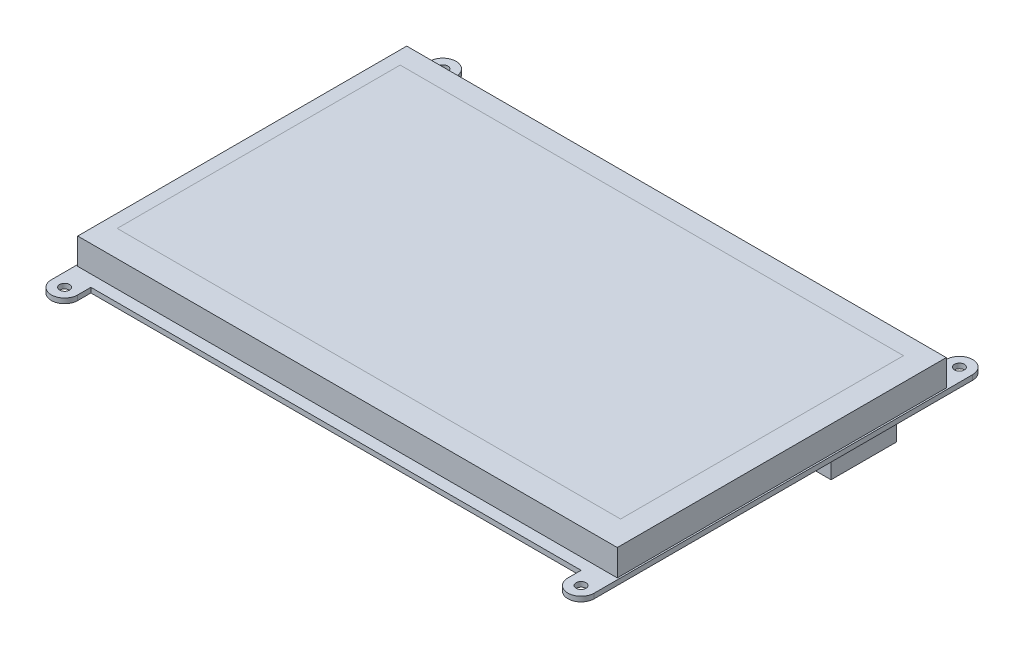
ISO-10303-21;
HEADER;
FILE_DESCRIPTION(('STEP AP214'),'2;1');
FILE_NAME('part.step','',(''),(''),'','','');
FILE_SCHEMA(('AUTOMOTIVE_DESIGN { 1 0 10303 214 1 1 1 1 }'));
ENDSEC;
DATA;
#1=APPLICATION_CONTEXT('core data for automotive mechanical design processes');
#2=APPLICATION_PROTOCOL_DEFINITION('international standard','automotive_design',2000,#1);
#3=PRODUCT_CONTEXT('',#1,'mechanical');
#4=PRODUCT('Part','Part','',(#3));
#5=PRODUCT_RELATED_PRODUCT_CATEGORY('part','',(#4));
#6=PRODUCT_DEFINITION_FORMATION('','',#4);
#7=PRODUCT_DEFINITION_CONTEXT('part definition',#1,'design');
#8=PRODUCT_DEFINITION('design','',#6,#7);
#9=PRODUCT_DEFINITION_SHAPE('','',#8);
#10=(LENGTH_UNIT() NAMED_UNIT(*) SI_UNIT(.MILLI.,.METRE.));
#11=(NAMED_UNIT(*) PLANE_ANGLE_UNIT() SI_UNIT($,.RADIAN.));
#12=(NAMED_UNIT(*) SI_UNIT($,.STERADIAN.) SOLID_ANGLE_UNIT());
#13=UNCERTAINTY_MEASURE_WITH_UNIT(LENGTH_MEASURE(1.E-05),#10,'distance_accuracy_value','');
#14=(GEOMETRIC_REPRESENTATION_CONTEXT(3) GLOBAL_UNCERTAINTY_ASSIGNED_CONTEXT((#13)) GLOBAL_UNIT_ASSIGNED_CONTEXT((#10,
#11,#12)) REPRESENTATION_CONTEXT('',''));
#15=CARTESIAN_POINT('',(0.,0.,0.));
#16=DIRECTION('',(0.,0.,1.));
#17=DIRECTION('',(1.,0.,0.));
#18=AXIS2_PLACEMENT_3D('',#15,#16,#17);
#19=CARTESIAN_POINT('',(0.,9.5,0.));
#20=DIRECTION('',(0.,-1.,0.));
#21=DIRECTION('',(0.,0.,-1.));
#22=AXIS2_PLACEMENT_3D('',#19,#20,#21);
#23=PLANE('',#22);
#24=DIRECTION('',(0.,0.,-1.));
#25=VECTOR('',#24,1.);
#26=CARTESIAN_POINT('',(82.,9.5,50.));
#27=LINE('',#26,#25);
#28=CARTESIAN_POINT('',(82.,9.5,50.));
#29=VERTEX_POINT('',#28);
#30=CARTESIAN_POINT('',(82.,9.5,-50.));
#31=VERTEX_POINT('',#30);
#32=EDGE_CURVE('E216',#29,#31,#27,.T.);
#33=ORIENTED_EDGE('',*,*,#32,.T.);
#34=DIRECTION('',(-1.,0.,0.));
#35=VECTOR('',#34,1.);
#36=CARTESIAN_POINT('',(-82.,9.5,-50.));
#37=LINE('',#36,#35);
#38=CARTESIAN_POINT('',(-82.,9.5,-50.));
#39=VERTEX_POINT('',#38);
#40=EDGE_CURVE('E205',#31,#39,#37,.T.);
#41=ORIENTED_EDGE('',*,*,#40,.T.);
#42=DIRECTION('',(0.,0.,1.));
#43=VECTOR('',#42,1.);
#44=CARTESIAN_POINT('',(-82.,9.5,50.));
#45=LINE('',#44,#43);
#46=CARTESIAN_POINT('',(-82.,9.5,50.));
#47=VERTEX_POINT('',#46);
#48=EDGE_CURVE('E215',#39,#47,#45,.T.);
#49=ORIENTED_EDGE('',*,*,#48,.T.);
#50=DIRECTION('',(1.,0.,0.));
#51=VECTOR('',#50,1.);
#52=CARTESIAN_POINT('',(-82.,9.5,50.));
#53=LINE('',#52,#51);
#54=EDGE_CURVE('E221',#47,#29,#53,.T.);
#55=ORIENTED_EDGE('',*,*,#54,.T.);
#56=EDGE_LOOP('',(#33,#41,#49,#55));
#57=FACE_BOUND('',#56,.T.);
#58=DIRECTION('',(0.,0.,1.));
#59=VECTOR('',#58,1.);
#60=CARTESIAN_POINT('',(-78.,9.5,0.));
#61=LINE('',#60,#59);
#62=CARTESIAN_POINT('',(-78.,9.5,-44.));
#63=VERTEX_POINT('',#62);
#64=CARTESIAN_POINT('',(-78.,9.5,42.));
#65=VERTEX_POINT('',#64);
#66=EDGE_CURVE('E11',#63,#65,#61,.T.);
#67=ORIENTED_EDGE('',*,*,#66,.F.);
#68=DIRECTION('',(-1.,0.,0.));
#69=VECTOR('',#68,1.);
#70=CARTESIAN_POINT('',(0.,9.5,-44.));
#71=LINE('',#70,#69);
#72=CARTESIAN_POINT('',(75.,9.5,-44.));
#73=VERTEX_POINT('',#72);
#74=EDGE_CURVE('E414',#73,#63,#71,.T.);
#75=ORIENTED_EDGE('',*,*,#74,.F.);
#76=DIRECTION('',(0.,0.,-1.));
#77=VECTOR('',#76,1.);
#78=CARTESIAN_POINT('',(75.,9.5,0.));
#79=LINE('',#78,#77);
#80=CARTESIAN_POINT('',(75.,9.5,42.));
#81=VERTEX_POINT('',#80);
#82=EDGE_CURVE('E417',#81,#73,#79,.T.);
#83=ORIENTED_EDGE('',*,*,#82,.F.);
#84=DIRECTION('',(1.,0.,0.));
#85=VECTOR('',#84,1.);
#86=CARTESIAN_POINT('',(0.,9.5,42.));
#87=LINE('',#86,#85);
#88=EDGE_CURVE('E46',#65,#81,#87,.T.);
#89=ORIENTED_EDGE('',*,*,#88,.F.);
#90=EDGE_LOOP('',(#67,#75,#83,#89));
#91=FACE_BOUND('',#90,.T.);
#92=ADVANCED_FACE('F37',(#57,#91),#23,.F.);
#93=CARTESIAN_POINT('',(78.5,1.5,-57.5));
#94=DIRECTION('',(0.,1.,0.));
#95=DIRECTION('',(0.,0.,1.));
#96=AXIS2_PLACEMENT_3D('',#93,#94,#95);
#97=PLANE('',#96);
#98=CARTESIAN_POINT('',(78.5,1.5,57.5));
#99=DIRECTION('',(0.,1.,0.));
#100=DIRECTION('',(0.,0.,-1.));
#101=AXIS2_PLACEMENT_3D('',#98,#99,#100);
#102=CIRCLE('',#101,1.5);
#103=CARTESIAN_POINT('',(78.5,1.5,56.));
#104=VERTEX_POINT('',#103);
#105=EDGE_CURVE('E309',#104,#104,#102,.T.);
#106=ORIENTED_EDGE('',*,*,#105,.F.);
#107=EDGE_LOOP('',(#106));
#108=FACE_BOUND('',#107,.T.);
#109=CARTESIAN_POINT('',(78.5,1.5,-57.5));
#110=DIRECTION('',(0.,1.,0.));
#111=DIRECTION('',(0.,0.,1.));
#112=AXIS2_PLACEMENT_3D('',#109,#110,#111);
#113=CIRCLE('',#112,1.5);
#114=CARTESIAN_POINT('',(78.5,1.5,-56.));
#115=VERTEX_POINT('',#114);
#116=EDGE_CURVE('E321',#115,#115,#113,.T.);
#117=ORIENTED_EDGE('',*,*,#116,.F.);
#118=EDGE_LOOP('',(#117));
#119=FACE_BOUND('',#118,.T.);
#120=DIRECTION('',(0.,0.,-1.));
#121=VECTOR('',#120,1.);
#122=CARTESIAN_POINT('',(82.5,1.5,-23.8776125592684));
#123=LINE('',#122,#121);
#124=CARTESIAN_POINT('',(82.5,1.5,57.5));
#125=VERTEX_POINT('',#124);
#126=CARTESIAN_POINT('',(82.5,1.5,-57.5));
#127=VERTEX_POINT('',#126);
#128=EDGE_CURVE('E327',#125,#127,#123,.T.);
#129=ORIENTED_EDGE('',*,*,#128,.T.);
#130=CARTESIAN_POINT('',(78.5,1.5,-57.5));
#131=DIRECTION('',(0.,1.,0.));
#132=DIRECTION('',(0.,0.,1.));
#133=AXIS2_PLACEMENT_3D('',#130,#131,#132);
#134=CIRCLE('',#133,4.);
#135=CARTESIAN_POINT('',(74.5,1.5,-57.5));
#136=VERTEX_POINT('',#135);
#137=EDGE_CURVE('E330',#127,#136,#134,.T.);
#138=ORIENTED_EDGE('',*,*,#137,.T.);
#139=DIRECTION('',(0.,0.,1.));
#140=VECTOR('',#139,1.);
#141=CARTESIAN_POINT('',(74.5,1.5,-57.5));
#142=LINE('',#141,#140);
#143=CARTESIAN_POINT('',(74.5,1.5,-53.5));
#144=VERTEX_POINT('',#143);
#145=EDGE_CURVE('E333',#136,#144,#142,.T.);
#146=ORIENTED_EDGE('',*,*,#145,.T.);
#147=DIRECTION('',(-1.,0.,0.));
#148=VECTOR('',#147,1.);
#149=CARTESIAN_POINT('',(-74.5,1.5,-53.5));
#150=LINE('',#149,#148);
#151=CARTESIAN_POINT('',(-74.5,1.5,-53.5));
#152=VERTEX_POINT('',#151);
#153=EDGE_CURVE('E335',#144,#152,#150,.T.);
#154=ORIENTED_EDGE('',*,*,#153,.T.);
#155=DIRECTION('',(0.,0.,-1.));
#156=VECTOR('',#155,1.);
#157=CARTESIAN_POINT('',(-74.5,1.5,-57.5));
#158=LINE('',#157,#156);
#159=CARTESIAN_POINT('',(-74.5,1.5,-57.5));
#160=VERTEX_POINT('',#159);
#161=EDGE_CURVE('E337',#152,#160,#158,.T.);
#162=ORIENTED_EDGE('',*,*,#161,.T.);
#163=CARTESIAN_POINT('',(-78.5,1.5,-57.5));
#164=DIRECTION('',(0.,1.,0.));
#165=DIRECTION('',(0.,0.,-1.));
#166=AXIS2_PLACEMENT_3D('',#163,#164,#165);
#167=CIRCLE('',#166,4.);
#168=CARTESIAN_POINT('',(-82.5,1.5,-57.5));
#169=VERTEX_POINT('',#168);
#170=EDGE_CURVE('E339',#160,#169,#167,.T.);
#171=ORIENTED_EDGE('',*,*,#170,.T.);
#172=DIRECTION('',(0.,0.,1.));
#173=VECTOR('',#172,1.);
#174=CARTESIAN_POINT('',(-82.5,1.5,-23.8776125592684));
#175=LINE('',#174,#173);
#176=CARTESIAN_POINT('',(-82.5,1.5,57.5));
#177=VERTEX_POINT('',#176);
#178=EDGE_CURVE('E341',#169,#177,#175,.T.);
#179=ORIENTED_EDGE('',*,*,#178,.T.);
#180=CARTESIAN_POINT('',(-78.5,1.5,57.5));
#181=DIRECTION('',(0.,1.,0.));
#182=DIRECTION('',(0.,0.,1.));
#183=AXIS2_PLACEMENT_3D('',#180,#181,#182);
#184=CIRCLE('',#183,4.);
#185=CARTESIAN_POINT('',(-74.5,1.5,57.5));
#186=VERTEX_POINT('',#185);
#187=EDGE_CURVE('E343',#177,#186,#184,.T.);
#188=ORIENTED_EDGE('',*,*,#187,.T.);
#189=DIRECTION('',(0.,0.,-1.));
#190=VECTOR('',#189,1.);
#191=CARTESIAN_POINT('',(-74.5,1.5,57.5));
#192=LINE('',#191,#190);
#193=CARTESIAN_POINT('',(-74.5,1.5,53.5));
#194=VERTEX_POINT('',#193);
#195=EDGE_CURVE('E345',#186,#194,#192,.T.);
#196=ORIENTED_EDGE('',*,*,#195,.T.);
#197=DIRECTION('',(1.,0.,0.));
#198=VECTOR('',#197,1.);
#199=CARTESIAN_POINT('',(-74.5,1.5,53.5));
#200=LINE('',#199,#198);
#201=CARTESIAN_POINT('',(74.5,1.5,53.5));
#202=VERTEX_POINT('',#201);
#203=EDGE_CURVE('E347',#194,#202,#200,.T.);
#204=ORIENTED_EDGE('',*,*,#203,.T.);
#205=DIRECTION('',(0.,0.,1.));
#206=VECTOR('',#205,1.);
#207=CARTESIAN_POINT('',(74.5,1.5,57.5));
#208=LINE('',#207,#206);
#209=CARTESIAN_POINT('',(74.5,1.5,57.5));
#210=VERTEX_POINT('',#209);
#211=EDGE_CURVE('E349',#202,#210,#208,.T.);
#212=ORIENTED_EDGE('',*,*,#211,.T.);
#213=CARTESIAN_POINT('',(78.5,1.5,57.5));
#214=DIRECTION('',(0.,1.,0.));
#215=DIRECTION('',(0.,0.,-1.));
#216=AXIS2_PLACEMENT_3D('',#213,#214,#215);
#217=CIRCLE('',#216,4.);
#218=EDGE_CURVE('E351',#210,#125,#217,.T.);
#219=ORIENTED_EDGE('',*,*,#218,.T.);
#220=EDGE_LOOP('',(#129,#138,#146,#154,#162,#171,#179,#188,#196,#204,#212,#219));
#221=FACE_BOUND('',#220,.T.);
#222=CARTESIAN_POINT('',(-78.5,1.5,-57.5));
#223=DIRECTION('',(0.,1.,0.));
#224=DIRECTION('',(0.,0.,-1.));
#225=AXIS2_PLACEMENT_3D('',#222,#223,#224);
#226=CIRCLE('',#225,1.5);
#227=CARTESIAN_POINT('',(-78.5,1.5,-59.));
#228=VERTEX_POINT('',#227);
#229=EDGE_CURVE('E315',#228,#228,#226,.T.);
#230=ORIENTED_EDGE('',*,*,#229,.F.);
#231=EDGE_LOOP('',(#230));
#232=FACE_BOUND('',#231,.T.);
#233=CARTESIAN_POINT('',(-78.5,1.5,57.5));
#234=DIRECTION('',(0.,1.,0.));
#235=DIRECTION('',(0.,0.,1.));
#236=AXIS2_PLACEMENT_3D('',#233,#234,#235);
#237=CIRCLE('',#236,1.5);
#238=CARTESIAN_POINT('',(-78.5,1.5,59.));
#239=VERTEX_POINT('',#238);
#240=EDGE_CURVE('E303',#239,#239,#237,.T.);
#241=ORIENTED_EDGE('',*,*,#240,.F.);
#242=EDGE_LOOP('',(#241));
#243=FACE_BOUND('',#242,.T.);
#244=DIRECTION('',(-1.,0.,0.));
#245=VECTOR('',#244,1.);
#246=CARTESIAN_POINT('',(-82.,1.5,-50.));
#247=LINE('',#246,#245);
#248=CARTESIAN_POINT('',(82.,1.5,-50.));
#249=VERTEX_POINT('',#248);
#250=CARTESIAN_POINT('',(-82.,1.5,-50.));
#251=VERTEX_POINT('',#250);
#252=EDGE_CURVE('E603',#249,#251,#247,.T.);
#253=ORIENTED_EDGE('',*,*,#252,.F.);
#254=DIRECTION('',(0.,0.,-1.));
#255=VECTOR('',#254,1.);
#256=CARTESIAN_POINT('',(82.,1.5,50.));
#257=LINE('',#256,#255);
#258=CARTESIAN_POINT('',(82.,1.5,50.));
#259=VERTEX_POINT('',#258);
#260=EDGE_CURVE('E229',#259,#249,#257,.T.);
#261=ORIENTED_EDGE('',*,*,#260,.F.);
#262=DIRECTION('',(1.,0.,0.));
#263=VECTOR('',#262,1.);
#264=CARTESIAN_POINT('',(-82.,1.5,50.));
#265=LINE('',#264,#263);
#266=CARTESIAN_POINT('',(-82.,1.5,50.));
#267=VERTEX_POINT('',#266);
#268=EDGE_CURVE('E225',#267,#259,#265,.T.);
#269=ORIENTED_EDGE('',*,*,#268,.F.);
#270=DIRECTION('',(0.,0.,1.));
#271=VECTOR('',#270,1.);
#272=CARTESIAN_POINT('',(-82.,1.5,50.));
#273=LINE('',#272,#271);
#274=EDGE_CURVE('E606',#251,#267,#273,.T.);
#275=ORIENTED_EDGE('',*,*,#274,.F.);
#276=EDGE_LOOP('',(#253,#261,#269,#275));
#277=FACE_BOUND('',#276,.T.);
#278=ADVANCED_FACE('F431',(#108,#119,#221,#232,#243,#277),#97,.T.);
#279=CARTESIAN_POINT('',(78.5,0.,-57.5));
#280=DIRECTION('',(0.,1.,0.));
#281=DIRECTION('',(0.,0.,1.));
#282=AXIS2_PLACEMENT_3D('',#279,#280,#281);
#283=PLANE('',#282);
#284=DIRECTION('',(0.,0.,1.));
#285=VECTOR('',#284,1.);
#286=CARTESIAN_POINT('',(79.1701948027992,0.,-17.8024890771553));
#287=LINE('',#286,#285);
#288=CARTESIAN_POINT('',(79.1701948027992,0.,-37.6392276149886));
#289=VERTEX_POINT('',#288);
#290=CARTESIAN_POINT('',(79.1701948027992,0.,-17.8024890771553));
#291=VERTEX_POINT('',#290);
#292=EDGE_CURVE('E269',#289,#291,#287,.T.);
#293=ORIENTED_EDGE('',*,*,#292,.F.);
#294=DIRECTION('',(1.,0.,0.));
#295=VECTOR('',#294,1.);
#296=CARTESIAN_POINT('',(70.674249382904,0.,-37.6392276149886));
#297=LINE('',#296,#295);
#298=CARTESIAN_POINT('',(70.674249382904,0.,-37.6392276149886));
#299=VERTEX_POINT('',#298);
#300=EDGE_CURVE('E274',#299,#289,#297,.T.);
#301=ORIENTED_EDGE('',*,*,#300,.F.);
#302=DIRECTION('',(0.,0.,-1.));
#303=VECTOR('',#302,1.);
#304=CARTESIAN_POINT('',(70.674249382904,0.,-17.8024890771553));
#305=LINE('',#304,#303);
#306=CARTESIAN_POINT('',(70.674249382904,0.,-17.8024890771553));
#307=VERTEX_POINT('',#306);
#308=EDGE_CURVE('E286',#307,#299,#305,.T.);
#309=ORIENTED_EDGE('',*,*,#308,.F.);
#310=DIRECTION('',(-1.,0.,0.));
#311=VECTOR('',#310,1.);
#312=CARTESIAN_POINT('',(70.674249382904,0.,-17.8024890771553));
#313=LINE('',#312,#311);
#314=EDGE_CURVE('E283',#291,#307,#313,.T.);
#315=ORIENTED_EDGE('',*,*,#314,.F.);
#316=EDGE_LOOP('',(#293,#301,#309,#315));
#317=FACE_BOUND('',#316,.T.);
#318=CARTESIAN_POINT('',(78.5,0.,-57.5));
#319=DIRECTION('',(0.,1.,0.));
#320=DIRECTION('',(0.,0.,1.));
#321=AXIS2_PLACEMENT_3D('',#318,#319,#320);
#322=CIRCLE('',#321,4.);
#323=CARTESIAN_POINT('',(82.5,0.,-57.5));
#324=VERTEX_POINT('',#323);
#325=CARTESIAN_POINT('',(74.5,0.,-57.5));
#326=VERTEX_POINT('',#325);
#327=EDGE_CURVE('E324',#324,#326,#322,.T.);
#328=ORIENTED_EDGE('',*,*,#327,.F.);
#329=DIRECTION('',(0.,0.,-1.));
#330=VECTOR('',#329,1.);
#331=CARTESIAN_POINT('',(82.5,0.,23.8776125592684));
#332=LINE('',#331,#330);
#333=CARTESIAN_POINT('',(82.5,0.,57.5));
#334=VERTEX_POINT('',#333);
#335=EDGE_CURVE('E331',#334,#324,#332,.T.);
#336=ORIENTED_EDGE('',*,*,#335,.F.);
#337=CARTESIAN_POINT('',(78.5,0.,57.5));
#338=DIRECTION('',(0.,1.,0.));
#339=DIRECTION('',(0.,0.,-1.));
#340=AXIS2_PLACEMENT_3D('',#337,#338,#339);
#341=CIRCLE('',#340,4.);
#342=CARTESIAN_POINT('',(74.5,0.,57.5));
#343=VERTEX_POINT('',#342);
#344=EDGE_CURVE('E375',#343,#334,#341,.T.);
#345=ORIENTED_EDGE('',*,*,#344,.F.);
#346=DIRECTION('',(0.,0.,1.));
#347=VECTOR('',#346,1.);
#348=CARTESIAN_POINT('',(74.5,0.,57.5));
#349=LINE('',#348,#347);
#350=CARTESIAN_POINT('',(74.5,0.,53.5));
#351=VERTEX_POINT('',#350);
#352=EDGE_CURVE('E373',#351,#343,#349,.T.);
#353=ORIENTED_EDGE('',*,*,#352,.F.);
#354=DIRECTION('',(1.,0.,0.));
#355=VECTOR('',#354,1.);
#356=CARTESIAN_POINT('',(-74.5,0.,53.5));
#357=LINE('',#356,#355);
#358=CARTESIAN_POINT('',(-74.5,0.,53.5));
#359=VERTEX_POINT('',#358);
#360=EDGE_CURVE('E371',#359,#351,#357,.T.);
#361=ORIENTED_EDGE('',*,*,#360,.F.);
#362=DIRECTION('',(0.,0.,-1.));
#363=VECTOR('',#362,1.);
#364=CARTESIAN_POINT('',(-74.5,0.,57.5));
#365=LINE('',#364,#363);
#366=CARTESIAN_POINT('',(-74.5,0.,57.5));
#367=VERTEX_POINT('',#366);
#368=EDGE_CURVE('E369',#367,#359,#365,.T.);
#369=ORIENTED_EDGE('',*,*,#368,.F.);
#370=CARTESIAN_POINT('',(-78.5,0.,57.5));
#371=DIRECTION('',(0.,1.,0.));
#372=DIRECTION('',(0.,0.,1.));
#373=AXIS2_PLACEMENT_3D('',#370,#371,#372);
#374=CIRCLE('',#373,4.);
#375=CARTESIAN_POINT('',(-82.5,0.,57.5));
#376=VERTEX_POINT('',#375);
#377=EDGE_CURVE('E367',#376,#367,#374,.T.);
#378=ORIENTED_EDGE('',*,*,#377,.F.);
#379=DIRECTION('',(0.,0.,1.));
#380=VECTOR('',#379,1.);
#381=CARTESIAN_POINT('',(-82.5,0.,23.8776125592684));
#382=LINE('',#381,#380);
#383=CARTESIAN_POINT('',(-82.5,0.,-57.5));
#384=VERTEX_POINT('',#383);
#385=EDGE_CURVE('E365',#384,#376,#382,.T.);
#386=ORIENTED_EDGE('',*,*,#385,.F.);
#387=CARTESIAN_POINT('',(-78.5,0.,-57.5));
#388=DIRECTION('',(0.,1.,0.));
#389=DIRECTION('',(0.,0.,-1.));
#390=AXIS2_PLACEMENT_3D('',#387,#388,#389);
#391=CIRCLE('',#390,4.);
#392=CARTESIAN_POINT('',(-74.5,0.,-57.5));
#393=VERTEX_POINT('',#392);
#394=EDGE_CURVE('E362',#393,#384,#391,.T.);
#395=ORIENTED_EDGE('',*,*,#394,.F.);
#396=DIRECTION('',(0.,0.,-1.));
#397=VECTOR('',#396,1.);
#398=CARTESIAN_POINT('',(-74.5,0.,-57.5));
#399=LINE('',#398,#397);
#400=CARTESIAN_POINT('',(-74.5,0.,-53.5));
#401=VERTEX_POINT('',#400);
#402=EDGE_CURVE('E360',#401,#393,#399,.T.);
#403=ORIENTED_EDGE('',*,*,#402,.F.);
#404=DIRECTION('',(-1.,0.,0.));
#405=VECTOR('',#404,1.);
#406=CARTESIAN_POINT('',(-74.5,0.,-53.5));
#407=LINE('',#406,#405);
#408=CARTESIAN_POINT('',(74.5,0.,-53.5));
#409=VERTEX_POINT('',#408);
#410=EDGE_CURVE('E358',#409,#401,#407,.T.);
#411=ORIENTED_EDGE('',*,*,#410,.F.);
#412=DIRECTION('',(0.,0.,1.));
#413=VECTOR('',#412,1.);
#414=CARTESIAN_POINT('',(74.5,0.,-57.5));
#415=LINE('',#414,#413);
#416=EDGE_CURVE('E356',#326,#409,#415,.T.);
#417=ORIENTED_EDGE('',*,*,#416,.F.);
#418=EDGE_LOOP('',(#328,#336,#345,#353,#361,#369,#378,#386,#395,#403,#411,#417));
#419=FACE_BOUND('',#418,.T.);
#420=CARTESIAN_POINT('',(78.5,0.,-57.5));
#421=DIRECTION('',(0.,1.,0.));
#422=DIRECTION('',(0.,0.,1.));
#423=AXIS2_PLACEMENT_3D('',#420,#421,#422);
#424=CIRCLE('',#423,1.5);
#425=CARTESIAN_POINT('',(78.5,0.,-56.));
#426=VERTEX_POINT('',#425);
#427=EDGE_CURVE('E318',#426,#426,#424,.T.);
#428=ORIENTED_EDGE('',*,*,#427,.T.);
#429=EDGE_LOOP('',(#428));
#430=FACE_BOUND('',#429,.T.);
#431=CARTESIAN_POINT('',(-78.5,0.,-57.5));
#432=DIRECTION('',(0.,1.,0.));
#433=DIRECTION('',(0.,0.,-1.));
#434=AXIS2_PLACEMENT_3D('',#431,#432,#433);
#435=CIRCLE('',#434,1.5);
#436=CARTESIAN_POINT('',(-78.5,0.,-59.));
#437=VERTEX_POINT('',#436);
#438=EDGE_CURVE('E312',#437,#437,#435,.T.);
#439=ORIENTED_EDGE('',*,*,#438,.T.);
#440=EDGE_LOOP('',(#439));
#441=FACE_BOUND('',#440,.T.);
#442=CARTESIAN_POINT('',(78.5,0.,57.5));
#443=DIRECTION('',(0.,1.,0.));
#444=DIRECTION('',(0.,0.,-1.));
#445=AXIS2_PLACEMENT_3D('',#442,#443,#444);
#446=CIRCLE('',#445,1.5);
#447=CARTESIAN_POINT('',(78.5,0.,56.));
#448=VERTEX_POINT('',#447);
#449=EDGE_CURVE('E306',#448,#448,#446,.T.);
#450=ORIENTED_EDGE('',*,*,#449,.T.);
#451=EDGE_LOOP('',(#450));
#452=FACE_BOUND('',#451,.T.);
#453=CARTESIAN_POINT('',(-78.5,0.,57.5));
#454=DIRECTION('',(0.,1.,0.));
#455=DIRECTION('',(0.,0.,1.));
#456=AXIS2_PLACEMENT_3D('',#453,#454,#455);
#457=CIRCLE('',#456,1.5);
#458=CARTESIAN_POINT('',(-78.5,0.,59.));
#459=VERTEX_POINT('',#458);
#460=EDGE_CURVE('E302',#459,#459,#457,.T.);
#461=ORIENTED_EDGE('',*,*,#460,.T.);
#462=EDGE_LOOP('',(#461));
#463=FACE_BOUND('',#462,.T.);
#464=DIRECTION('',(0.,0.,1.));
#465=VECTOR('',#464,1.);
#466=CARTESIAN_POINT('',(0.,0.,-5.99759004882117));
#467=LINE('',#466,#465);
#468=CARTESIAN_POINT('',(0.,0.,-15.8758505932042));
#469=VERTEX_POINT('',#468);
#470=CARTESIAN_POINT('',(0.,0.,-5.99759004882117));
#471=VERTEX_POINT('',#470);
#472=EDGE_CURVE('E231',#469,#471,#467,.T.);
#473=ORIENTED_EDGE('',*,*,#472,.F.);
#474=DIRECTION('',(1.,0.,0.));
#475=VECTOR('',#474,1.);
#476=CARTESIAN_POINT('',(-18.5141326990674,0.,-15.8758505932042));
#477=LINE('',#476,#475);
#478=CARTESIAN_POINT('',(-18.5141326990674,0.,-15.8758505932042));
#479=VERTEX_POINT('',#478);
#480=EDGE_CURVE('E244',#479,#469,#477,.T.);
#481=ORIENTED_EDGE('',*,*,#480,.F.);
#482=DIRECTION('',(0.,0.,-1.));
#483=VECTOR('',#482,1.);
#484=CARTESIAN_POINT('',(-18.5141326990674,0.,-5.99759004882117));
#485=LINE('',#484,#483);
#486=CARTESIAN_POINT('',(-18.5141326990674,0.,-5.99759004882117));
#487=VERTEX_POINT('',#486);
#488=EDGE_CURVE('E253',#487,#479,#485,.T.);
#489=ORIENTED_EDGE('',*,*,#488,.F.);
#490=DIRECTION('',(-1.,0.,0.));
#491=VECTOR('',#490,1.);
#492=CARTESIAN_POINT('',(-18.5141326990674,0.,-5.99759004882117));
#493=LINE('',#492,#491);
#494=EDGE_CURVE('E234',#471,#487,#493,.T.);
#495=ORIENTED_EDGE('',*,*,#494,.F.);
#496=EDGE_LOOP('',(#473,#481,#489,#495));
#497=FACE_BOUND('',#496,.T.);
#498=ADVANCED_FACE('F436',(#317,#419,#430,#441,#452,#463,#497),#283,.F.);
#499=CARTESIAN_POINT('',(78.5,1.5,-57.5));
#500=DIRECTION('',(0.,-1.,0.));
#501=DIRECTION('',(0.,0.,-1.));
#502=AXIS2_PLACEMENT_3D('',#499,#500,#501);
#503=CYLINDRICAL_SURFACE('',#502,4.);
#504=ORIENTED_EDGE('',*,*,#327,.T.);
#505=DIRECTION('',(0.,-1.,0.));
#506=VECTOR('',#505,1.);
#507=CARTESIAN_POINT('',(74.5,1.5,-57.5));
#508=LINE('',#507,#506);
#509=EDGE_CURVE('E408',#136,#326,#508,.T.);
#510=ORIENTED_EDGE('',*,*,#509,.F.);
#511=ORIENTED_EDGE('',*,*,#137,.F.);
#512=DIRECTION('',(0.,-1.,0.));
#513=VECTOR('',#512,1.);
#514=CARTESIAN_POINT('',(82.5,1.5,-57.5));
#515=LINE('',#514,#513);
#516=EDGE_CURVE('E411',#127,#324,#515,.T.);
#517=ORIENTED_EDGE('',*,*,#516,.T.);
#518=EDGE_LOOP('',(#504,#510,#511,#517));
#519=FACE_BOUND('',#518,.T.);
#520=ADVANCED_FACE('F39',(#519),#503,.T.);
#521=CARTESIAN_POINT('',(74.5,1.5,-57.5));
#522=DIRECTION('',(1.,0.,0.));
#523=DIRECTION('',(0.,0.,-1.));
#524=AXIS2_PLACEMENT_3D('',#521,#522,#523);
#525=PLANE('',#524);
#526=ORIENTED_EDGE('',*,*,#416,.T.);
#527=DIRECTION('',(0.,-1.,0.));
#528=VECTOR('',#527,1.);
#529=CARTESIAN_POINT('',(74.5,1.5,-53.5));
#530=LINE('',#529,#528);
#531=EDGE_CURVE('E405',#144,#409,#530,.T.);
#532=ORIENTED_EDGE('',*,*,#531,.F.);
#533=ORIENTED_EDGE('',*,*,#145,.F.);
#534=ORIENTED_EDGE('',*,*,#509,.T.);
#535=EDGE_LOOP('',(#526,#532,#533,#534));
#536=FACE_BOUND('',#535,.T.);
#537=ADVANCED_FACE('F554',(#536),#525,.F.);
#538=CARTESIAN_POINT('',(-74.5,1.5,-53.5));
#539=DIRECTION('',(0.,0.,1.));
#540=DIRECTION('',(1.,0.,0.));
#541=AXIS2_PLACEMENT_3D('',#538,#539,#540);
#542=PLANE('',#541);
#543=ORIENTED_EDGE('',*,*,#410,.T.);
#544=DIRECTION('',(0.,-1.,0.));
#545=VECTOR('',#544,1.);
#546=CARTESIAN_POINT('',(-74.5,1.5,-53.5));
#547=LINE('',#546,#545);
#548=EDGE_CURVE('E402',#152,#401,#547,.T.);
#549=ORIENTED_EDGE('',*,*,#548,.F.);
#550=ORIENTED_EDGE('',*,*,#153,.F.);
#551=ORIENTED_EDGE('',*,*,#531,.T.);
#552=EDGE_LOOP('',(#543,#549,#550,#551));
#553=FACE_BOUND('',#552,.T.);
#554=ADVANCED_FACE('F551',(#553),#542,.F.);
#555=CARTESIAN_POINT('',(-74.5,1.5,-57.5));
#556=DIRECTION('',(-1.,0.,0.));
#557=DIRECTION('',(0.,0.,1.));
#558=AXIS2_PLACEMENT_3D('',#555,#556,#557);
#559=PLANE('',#558);
#560=ORIENTED_EDGE('',*,*,#402,.T.);
#561=DIRECTION('',(0.,-1.,0.));
#562=VECTOR('',#561,1.);
#563=CARTESIAN_POINT('',(-74.5,1.5,-57.5));
#564=LINE('',#563,#562);
#565=EDGE_CURVE('E399',#160,#393,#564,.T.);
#566=ORIENTED_EDGE('',*,*,#565,.F.);
#567=ORIENTED_EDGE('',*,*,#161,.F.);
#568=ORIENTED_EDGE('',*,*,#548,.T.);
#569=EDGE_LOOP('',(#560,#566,#567,#568));
#570=FACE_BOUND('',#569,.T.);
#571=ADVANCED_FACE('F547',(#570),#559,.F.);
#572=CARTESIAN_POINT('',(-78.5,1.5,-57.5));
#573=DIRECTION('',(0.,-1.,0.));
#574=DIRECTION('',(0.,0.,-1.));
#575=AXIS2_PLACEMENT_3D('',#572,#573,#574);
#576=CYLINDRICAL_SURFACE('',#575,4.);
#577=ORIENTED_EDGE('',*,*,#394,.T.);
#578=DIRECTION('',(0.,-1.,0.));
#579=VECTOR('',#578,1.);
#580=CARTESIAN_POINT('',(-82.5,1.5,-57.5));
#581=LINE('',#580,#579);
#582=EDGE_CURVE('E396',#169,#384,#581,.T.);
#583=ORIENTED_EDGE('',*,*,#582,.F.);
#584=ORIENTED_EDGE('',*,*,#170,.F.);
#585=ORIENTED_EDGE('',*,*,#565,.T.);
#586=EDGE_LOOP('',(#577,#583,#584,#585));
#587=FACE_BOUND('',#586,.T.);
#588=ADVANCED_FACE('F543',(#587),#576,.T.);
#589=CARTESIAN_POINT('',(-82.5,1.5,23.8776125592684));
#590=DIRECTION('',(1.,0.,0.));
#591=DIRECTION('',(0.,0.,-1.));
#592=AXIS2_PLACEMENT_3D('',#589,#590,#591);
#593=PLANE('',#592);
#594=ORIENTED_EDGE('',*,*,#385,.T.);
#595=DIRECTION('',(0.,-1.,0.));
#596=VECTOR('',#595,1.);
#597=CARTESIAN_POINT('',(-82.5,1.5,57.5));
#598=LINE('',#597,#596);
#599=EDGE_CURVE('E393',#177,#376,#598,.T.);
#600=ORIENTED_EDGE('',*,*,#599,.F.);
#601=ORIENTED_EDGE('',*,*,#178,.F.);
#602=ORIENTED_EDGE('',*,*,#582,.T.);
#603=EDGE_LOOP('',(#594,#600,#601,#602));
#604=FACE_BOUND('',#603,.T.);
#605=ADVANCED_FACE('F539',(#604),#593,.F.);
#606=CARTESIAN_POINT('',(-78.5,1.5,57.5));
#607=DIRECTION('',(0.,-1.,0.));
#608=DIRECTION('',(0.,0.,-1.));
#609=AXIS2_PLACEMENT_3D('',#606,#607,#608);
#610=CYLINDRICAL_SURFACE('',#609,4.);
#611=ORIENTED_EDGE('',*,*,#377,.T.);
#612=DIRECTION('',(0.,-1.,0.));
#613=VECTOR('',#612,1.);
#614=CARTESIAN_POINT('',(-74.5,1.5,57.5));
#615=LINE('',#614,#613);
#616=EDGE_CURVE('E390',#186,#367,#615,.T.);
#617=ORIENTED_EDGE('',*,*,#616,.F.);
#618=ORIENTED_EDGE('',*,*,#187,.F.);
#619=ORIENTED_EDGE('',*,*,#599,.T.);
#620=EDGE_LOOP('',(#611,#617,#618,#619));
#621=FACE_BOUND('',#620,.T.);
#622=ADVANCED_FACE('F535',(#621),#610,.T.);
#623=CARTESIAN_POINT('',(-74.5,1.5,57.5));
#624=DIRECTION('',(-1.,0.,0.));
#625=DIRECTION('',(0.,0.,1.));
#626=AXIS2_PLACEMENT_3D('',#623,#624,#625);
#627=PLANE('',#626);
#628=ORIENTED_EDGE('',*,*,#368,.T.);
#629=DIRECTION('',(0.,-1.,0.));
#630=VECTOR('',#629,1.);
#631=CARTESIAN_POINT('',(-74.5,1.5,53.5));
#632=LINE('',#631,#630);
#633=EDGE_CURVE('E387',#194,#359,#632,.T.);
#634=ORIENTED_EDGE('',*,*,#633,.F.);
#635=ORIENTED_EDGE('',*,*,#195,.F.);
#636=ORIENTED_EDGE('',*,*,#616,.T.);
#637=EDGE_LOOP('',(#628,#634,#635,#636));
#638=FACE_BOUND('',#637,.T.);
#639=ADVANCED_FACE('F531',(#638),#627,.F.);
#640=CARTESIAN_POINT('',(-74.5,1.5,53.5));
#641=DIRECTION('',(0.,0.,-1.));
#642=DIRECTION('',(-1.,0.,0.));
#643=AXIS2_PLACEMENT_3D('',#640,#641,#642);
#644=PLANE('',#643);
#645=ORIENTED_EDGE('',*,*,#360,.T.);
#646=DIRECTION('',(0.,-1.,0.));
#647=VECTOR('',#646,1.);
#648=CARTESIAN_POINT('',(74.5,1.5,53.5));
#649=LINE('',#648,#647);
#650=EDGE_CURVE('E384',#202,#351,#649,.T.);
#651=ORIENTED_EDGE('',*,*,#650,.F.);
#652=ORIENTED_EDGE('',*,*,#203,.F.);
#653=ORIENTED_EDGE('',*,*,#633,.T.);
#654=EDGE_LOOP('',(#645,#651,#652,#653));
#655=FACE_BOUND('',#654,.T.);
#656=ADVANCED_FACE('F527',(#655),#644,.F.);
#657=CARTESIAN_POINT('',(74.5,1.5,57.5));
#658=DIRECTION('',(1.,0.,0.));
#659=DIRECTION('',(0.,0.,-1.));
#660=AXIS2_PLACEMENT_3D('',#657,#658,#659);
#661=PLANE('',#660);
#662=ORIENTED_EDGE('',*,*,#352,.T.);
#663=DIRECTION('',(0.,-1.,0.));
#664=VECTOR('',#663,1.);
#665=CARTESIAN_POINT('',(74.5,1.5,57.5));
#666=LINE('',#665,#664);
#667=EDGE_CURVE('E381',#210,#343,#666,.T.);
#668=ORIENTED_EDGE('',*,*,#667,.F.);
#669=ORIENTED_EDGE('',*,*,#211,.F.);
#670=ORIENTED_EDGE('',*,*,#650,.T.);
#671=EDGE_LOOP('',(#662,#668,#669,#670));
#672=FACE_BOUND('',#671,.T.);
#673=ADVANCED_FACE('F523',(#672),#661,.F.);
#674=CARTESIAN_POINT('',(78.5,1.5,57.5));
#675=DIRECTION('',(0.,-1.,0.));
#676=DIRECTION('',(0.,0.,-1.));
#677=AXIS2_PLACEMENT_3D('',#674,#675,#676);
#678=CYLINDRICAL_SURFACE('',#677,4.);
#679=ORIENTED_EDGE('',*,*,#344,.T.);
#680=DIRECTION('',(0.,-1.,0.));
#681=VECTOR('',#680,1.);
#682=CARTESIAN_POINT('',(82.5,1.5,57.5));
#683=LINE('',#682,#681);
#684=EDGE_CURVE('E354',#125,#334,#683,.T.);
#685=ORIENTED_EDGE('',*,*,#684,.F.);
#686=ORIENTED_EDGE('',*,*,#218,.F.);
#687=ORIENTED_EDGE('',*,*,#667,.T.);
#688=EDGE_LOOP('',(#679,#685,#686,#687));
#689=FACE_BOUND('',#688,.T.);
#690=ADVANCED_FACE('F519',(#689),#678,.T.);
#691=CARTESIAN_POINT('',(82.5,1.5,23.8776125592684));
#692=DIRECTION('',(-1.,0.,0.));
#693=DIRECTION('',(0.,0.,1.));
#694=AXIS2_PLACEMENT_3D('',#691,#692,#693);
#695=PLANE('',#694);
#696=ORIENTED_EDGE('',*,*,#335,.T.);
#697=ORIENTED_EDGE('',*,*,#516,.F.);
#698=ORIENTED_EDGE('',*,*,#128,.F.);
#699=ORIENTED_EDGE('',*,*,#684,.T.);
#700=EDGE_LOOP('',(#696,#697,#698,#699));
#701=FACE_BOUND('',#700,.T.);
#702=ADVANCED_FACE('F511',(#701),#695,.F.);
#703=CARTESIAN_POINT('',(78.5,1.5,-57.5));
#704=DIRECTION('',(0.,-1.,0.));
#705=DIRECTION('',(0.,0.,-1.));
#706=AXIS2_PLACEMENT_3D('',#703,#704,#705);
#707=CYLINDRICAL_SURFACE('',#706,1.5);
#708=ORIENTED_EDGE('',*,*,#116,.T.);
#709=EDGE_LOOP('',(#708));
#710=FACE_BOUND('',#709,.T.);
#711=ORIENTED_EDGE('',*,*,#427,.F.);
#712=EDGE_LOOP('',(#711));
#713=FACE_BOUND('',#712,.T.);
#714=ADVANCED_FACE('F508',(#710,#713),#707,.F.);
#715=CARTESIAN_POINT('',(-78.5,1.5,-57.5));
#716=DIRECTION('',(0.,-1.,0.));
#717=DIRECTION('',(0.,0.,-1.));
#718=AXIS2_PLACEMENT_3D('',#715,#716,#717);
#719=CYLINDRICAL_SURFACE('',#718,1.5);
#720=ORIENTED_EDGE('',*,*,#229,.T.);
#721=EDGE_LOOP('',(#720));
#722=FACE_BOUND('',#721,.T.);
#723=ORIENTED_EDGE('',*,*,#438,.F.);
#724=EDGE_LOOP('',(#723));
#725=FACE_BOUND('',#724,.T.);
#726=ADVANCED_FACE('F504',(#722,#725),#719,.F.);
#727=CARTESIAN_POINT('',(78.5,1.5,57.5));
#728=DIRECTION('',(0.,-1.,0.));
#729=DIRECTION('',(0.,0.,-1.));
#730=AXIS2_PLACEMENT_3D('',#727,#728,#729);
#731=CYLINDRICAL_SURFACE('',#730,1.5);
#732=ORIENTED_EDGE('',*,*,#105,.T.);
#733=EDGE_LOOP('',(#732));
#734=FACE_BOUND('',#733,.T.);
#735=ORIENTED_EDGE('',*,*,#449,.F.);
#736=EDGE_LOOP('',(#735));
#737=FACE_BOUND('',#736,.T.);
#738=ADVANCED_FACE('F500',(#734,#737),#731,.F.);
#739=CARTESIAN_POINT('',(-78.5,1.5,57.5));
#740=DIRECTION('',(0.,-1.,0.));
#741=DIRECTION('',(0.,0.,-1.));
#742=AXIS2_PLACEMENT_3D('',#739,#740,#741);
#743=CYLINDRICAL_SURFACE('',#742,1.5);
#744=ORIENTED_EDGE('',*,*,#240,.T.);
#745=EDGE_LOOP('',(#744));
#746=FACE_BOUND('',#745,.T.);
#747=ORIENTED_EDGE('',*,*,#460,.F.);
#748=EDGE_LOOP('',(#747));
#749=FACE_BOUND('',#748,.T.);
#750=ADVANCED_FACE('F496',(#746,#749),#743,.F.);
#751=CARTESIAN_POINT('',(79.1701948027992,-8.,-17.8024890771553));
#752=DIRECTION('',(-1.,0.,0.));
#753=DIRECTION('',(0.,0.,1.));
#754=AXIS2_PLACEMENT_3D('',#751,#752,#753);
#755=PLANE('',#754);
#756=ORIENTED_EDGE('',*,*,#292,.T.);
#757=DIRECTION('',(0.,1.,0.));
#758=VECTOR('',#757,1.);
#759=CARTESIAN_POINT('',(79.1701948027992,-8.,-17.8024890771553));
#760=LINE('',#759,#758);
#761=CARTESIAN_POINT('',(79.1701948027992,-8.,-17.8024890771553));
#762=VERTEX_POINT('',#761);
#763=EDGE_CURVE('E299',#762,#291,#760,.T.);
#764=ORIENTED_EDGE('',*,*,#763,.F.);
#765=DIRECTION('',(0.,0.,1.));
#766=VECTOR('',#765,1.);
#767=CARTESIAN_POINT('',(79.1701948027992,-8.,-17.8024890771553));
#768=LINE('',#767,#766);
#769=CARTESIAN_POINT('',(79.1701948027992,-8.,-37.6392276149886));
#770=VERTEX_POINT('',#769);
#771=EDGE_CURVE('E270',#770,#762,#768,.T.);
#772=ORIENTED_EDGE('',*,*,#771,.F.);
#773=DIRECTION('',(0.,1.,0.));
#774=VECTOR('',#773,1.);
#775=CARTESIAN_POINT('',(79.1701948027992,-8.,-37.6392276149886));
#776=LINE('',#775,#774);
#777=EDGE_CURVE('E280',#770,#289,#776,.T.);
#778=ORIENTED_EDGE('',*,*,#777,.T.);
#779=EDGE_LOOP('',(#756,#764,#772,#778));
#780=FACE_BOUND('',#779,.T.);
#781=ADVANCED_FACE('F492',(#780),#755,.F.);
#782=CARTESIAN_POINT('',(70.674249382904,-8.,-17.8024890771553));
#783=DIRECTION('',(0.,0.,-1.));
#784=DIRECTION('',(-1.,0.,0.));
#785=AXIS2_PLACEMENT_3D('',#782,#783,#784);
#786=PLANE('',#785);
#787=ORIENTED_EDGE('',*,*,#314,.T.);
#788=DIRECTION('',(0.,1.,0.));
#789=VECTOR('',#788,1.);
#790=CARTESIAN_POINT('',(70.674249382904,-8.,-17.8024890771553));
#791=LINE('',#790,#789);
#792=CARTESIAN_POINT('',(70.674249382904,-8.,-17.8024890771553));
#793=VERTEX_POINT('',#792);
#794=EDGE_CURVE('E296',#793,#307,#791,.T.);
#795=ORIENTED_EDGE('',*,*,#794,.F.);
#796=DIRECTION('',(-1.,0.,0.));
#797=VECTOR('',#796,1.);
#798=CARTESIAN_POINT('',(70.674249382904,-8.,-17.8024890771553));
#799=LINE('',#798,#797);
#800=EDGE_CURVE('E273',#762,#793,#799,.T.);
#801=ORIENTED_EDGE('',*,*,#800,.F.);
#802=ORIENTED_EDGE('',*,*,#763,.T.);
#803=EDGE_LOOP('',(#787,#795,#801,#802));
#804=FACE_BOUND('',#803,.T.);
#805=ADVANCED_FACE('F488',(#804),#786,.F.);
#806=CARTESIAN_POINT('',(70.674249382904,-8.,-17.8024890771553));
#807=DIRECTION('',(1.,0.,0.));
#808=DIRECTION('',(0.,0.,-1.));
#809=AXIS2_PLACEMENT_3D('',#806,#807,#808);
#810=PLANE('',#809);
#811=ORIENTED_EDGE('',*,*,#308,.T.);
#812=DIRECTION('',(0.,1.,0.));
#813=VECTOR('',#812,1.);
#814=CARTESIAN_POINT('',(70.674249382904,-8.,-37.6392276149886));
#815=LINE('',#814,#813);
#816=CARTESIAN_POINT('',(70.674249382904,-8.,-37.6392276149886));
#817=VERTEX_POINT('',#816);
#818=EDGE_CURVE('E293',#817,#299,#815,.T.);
#819=ORIENTED_EDGE('',*,*,#818,.F.);
#820=DIRECTION('',(0.,0.,-1.));
#821=VECTOR('',#820,1.);
#822=CARTESIAN_POINT('',(70.674249382904,-8.,-17.8024890771553));
#823=LINE('',#822,#821);
#824=EDGE_CURVE('E276',#793,#817,#823,.T.);
#825=ORIENTED_EDGE('',*,*,#824,.F.);
#826=ORIENTED_EDGE('',*,*,#794,.T.);
#827=EDGE_LOOP('',(#811,#819,#825,#826));
#828=FACE_BOUND('',#827,.T.);
#829=ADVANCED_FACE('F484',(#828),#810,.F.);
#830=CARTESIAN_POINT('',(70.674249382904,-8.,-37.6392276149886));
#831=DIRECTION('',(0.,0.,1.));
#832=DIRECTION('',(1.,0.,0.));
#833=AXIS2_PLACEMENT_3D('',#830,#831,#832);
#834=PLANE('',#833);
#835=ORIENTED_EDGE('',*,*,#300,.T.);
#836=ORIENTED_EDGE('',*,*,#777,.F.);
#837=DIRECTION('',(1.,0.,0.));
#838=VECTOR('',#837,1.);
#839=CARTESIAN_POINT('',(70.674249382904,-8.,-37.6392276149886));
#840=LINE('',#839,#838);
#841=EDGE_CURVE('E278',#817,#770,#840,.T.);
#842=ORIENTED_EDGE('',*,*,#841,.F.);
#843=ORIENTED_EDGE('',*,*,#818,.T.);
#844=EDGE_LOOP('',(#835,#836,#842,#843));
#845=FACE_BOUND('',#844,.T.);
#846=ADVANCED_FACE('F480',(#845),#834,.F.);
#847=CARTESIAN_POINT('',(0.,-8.,0.));
#848=DIRECTION('',(0.,-1.,0.));
#849=DIRECTION('',(0.,0.,-1.));
#850=AXIS2_PLACEMENT_3D('',#847,#848,#849);
#851=PLANE('',#850);
#852=ORIENTED_EDGE('',*,*,#771,.T.);
#853=ORIENTED_EDGE('',*,*,#800,.T.);
#854=ORIENTED_EDGE('',*,*,#824,.T.);
#855=ORIENTED_EDGE('',*,*,#841,.T.);
#856=EDGE_LOOP('',(#852,#853,#854,#855));
#857=FACE_BOUND('',#856,.T.);
#858=ADVANCED_FACE('F476',(#857),#851,.T.);
#859=CARTESIAN_POINT('',(0.,-8.,-5.99759004882117));
#860=DIRECTION('',(-1.,0.,0.));
#861=DIRECTION('',(0.,0.,1.));
#862=AXIS2_PLACEMENT_3D('',#859,#860,#861);
#863=PLANE('',#862);
#864=ORIENTED_EDGE('',*,*,#472,.T.);
#865=DIRECTION('',(0.,1.,0.));
#866=VECTOR('',#865,1.);
#867=CARTESIAN_POINT('',(0.,-8.,-5.99759004882117));
#868=LINE('',#867,#866);
#869=CARTESIAN_POINT('',(0.,-8.,-5.99759004882117));
#870=VERTEX_POINT('',#869);
#871=EDGE_CURVE('E266',#870,#471,#868,.T.);
#872=ORIENTED_EDGE('',*,*,#871,.F.);
#873=DIRECTION('',(0.,0.,1.));
#874=VECTOR('',#873,1.);
#875=CARTESIAN_POINT('',(0.,-8.,-5.99759004882117));
#876=LINE('',#875,#874);
#877=CARTESIAN_POINT('',(0.,-8.,-15.8758505932042));
#878=VERTEX_POINT('',#877);
#879=EDGE_CURVE('E240',#878,#870,#876,.T.);
#880=ORIENTED_EDGE('',*,*,#879,.F.);
#881=DIRECTION('',(0.,1.,0.));
#882=VECTOR('',#881,1.);
#883=CARTESIAN_POINT('',(0.,-8.,-15.8758505932042));
#884=LINE('',#883,#882);
#885=EDGE_CURVE('E249',#878,#469,#884,.T.);
#886=ORIENTED_EDGE('',*,*,#885,.T.);
#887=EDGE_LOOP('',(#864,#872,#880,#886));
#888=FACE_BOUND('',#887,.T.);
#889=ADVANCED_FACE('F472',(#888),#863,.F.);
#890=CARTESIAN_POINT('',(-18.5141326990674,-8.,-5.99759004882117));
#891=DIRECTION('',(0.,0.,-1.));
#892=DIRECTION('',(-1.,0.,0.));
#893=AXIS2_PLACEMENT_3D('',#890,#891,#892);
#894=PLANE('',#893);
#895=ORIENTED_EDGE('',*,*,#494,.T.);
#896=DIRECTION('',(0.,1.,0.));
#897=VECTOR('',#896,1.);
#898=CARTESIAN_POINT('',(-18.5141326990674,-8.,-5.99759004882117));
#899=LINE('',#898,#897);
#900=CARTESIAN_POINT('',(-18.5141326990674,-8.,-5.99759004882117));
#901=VERTEX_POINT('',#900);
#902=EDGE_CURVE('E263',#901,#487,#899,.T.);
#903=ORIENTED_EDGE('',*,*,#902,.F.);
#904=DIRECTION('',(-1.,0.,0.));
#905=VECTOR('',#904,1.);
#906=CARTESIAN_POINT('',(-18.5141326990674,-8.,-5.99759004882117));
#907=LINE('',#906,#905);
#908=EDGE_CURVE('E243',#870,#901,#907,.T.);
#909=ORIENTED_EDGE('',*,*,#908,.F.);
#910=ORIENTED_EDGE('',*,*,#871,.T.);
#911=EDGE_LOOP('',(#895,#903,#909,#910));
#912=FACE_BOUND('',#911,.T.);
#913=ADVANCED_FACE('F468',(#912),#894,.F.);
#914=CARTESIAN_POINT('',(-18.5141326990674,-8.,-5.99759004882117));
#915=DIRECTION('',(1.,0.,0.));
#916=DIRECTION('',(0.,0.,-1.));
#917=AXIS2_PLACEMENT_3D('',#914,#915,#916);
#918=PLANE('',#917);
#919=ORIENTED_EDGE('',*,*,#488,.T.);
#920=DIRECTION('',(0.,1.,0.));
#921=VECTOR('',#920,1.);
#922=CARTESIAN_POINT('',(-18.5141326990674,-8.,-15.8758505932042));
#923=LINE('',#922,#921);
#924=CARTESIAN_POINT('',(-18.5141326990674,-8.,-15.8758505932042));
#925=VERTEX_POINT('',#924);
#926=EDGE_CURVE('E260',#925,#479,#923,.T.);
#927=ORIENTED_EDGE('',*,*,#926,.F.);
#928=DIRECTION('',(0.,0.,-1.));
#929=VECTOR('',#928,1.);
#930=CARTESIAN_POINT('',(-18.5141326990674,-8.,-5.99759004882117));
#931=LINE('',#930,#929);
#932=EDGE_CURVE('E246',#901,#925,#931,.T.);
#933=ORIENTED_EDGE('',*,*,#932,.F.);
#934=ORIENTED_EDGE('',*,*,#902,.T.);
#935=EDGE_LOOP('',(#919,#927,#933,#934));
#936=FACE_BOUND('',#935,.T.);
#937=ADVANCED_FACE('F464',(#936),#918,.F.);
#938=CARTESIAN_POINT('',(-18.5141326990674,-8.,-15.8758505932042));
#939=DIRECTION('',(0.,0.,1.));
#940=DIRECTION('',(1.,0.,0.));
#941=AXIS2_PLACEMENT_3D('',#938,#939,#940);
#942=PLANE('',#941);
#943=ORIENTED_EDGE('',*,*,#480,.T.);
#944=ORIENTED_EDGE('',*,*,#885,.F.);
#945=DIRECTION('',(1.,0.,0.));
#946=VECTOR('',#945,1.);
#947=CARTESIAN_POINT('',(-18.5141326990674,-8.,-15.8758505932042));
#948=LINE('',#947,#946);
#949=EDGE_CURVE('E248',#925,#878,#948,.T.);
#950=ORIENTED_EDGE('',*,*,#949,.F.);
#951=ORIENTED_EDGE('',*,*,#926,.T.);
#952=EDGE_LOOP('',(#943,#944,#950,#951));
#953=FACE_BOUND('',#952,.T.);
#954=ADVANCED_FACE('F460',(#953),#942,.F.);
#955=CARTESIAN_POINT('',(0.,-8.,0.));
#956=DIRECTION('',(0.,-1.,0.));
#957=DIRECTION('',(0.,0.,-1.));
#958=AXIS2_PLACEMENT_3D('',#955,#956,#957);
#959=PLANE('',#958);
#960=ORIENTED_EDGE('',*,*,#879,.T.);
#961=ORIENTED_EDGE('',*,*,#908,.T.);
#962=ORIENTED_EDGE('',*,*,#932,.T.);
#963=ORIENTED_EDGE('',*,*,#949,.T.);
#964=EDGE_LOOP('',(#960,#961,#962,#963));
#965=FACE_BOUND('',#964,.T.);
#966=ADVANCED_FACE('F457',(#965),#959,.T.);
#967=CARTESIAN_POINT('',(82.,9.5,50.));
#968=DIRECTION('',(-1.,0.,0.));
#969=DIRECTION('',(0.,0.,1.));
#970=AXIS2_PLACEMENT_3D('',#967,#968,#969);
#971=PLANE('',#970);
#972=ORIENTED_EDGE('',*,*,#260,.T.);
#973=DIRECTION('',(0.,-1.,0.));
#974=VECTOR('',#973,1.);
#975=CARTESIAN_POINT('',(82.,9.5,-50.));
#976=LINE('',#975,#974);
#977=EDGE_CURVE('E209',#31,#249,#976,.T.);
#978=ORIENTED_EDGE('',*,*,#977,.F.);
#979=ORIENTED_EDGE('',*,*,#32,.F.);
#980=DIRECTION('',(0.,-1.,0.));
#981=VECTOR('',#980,1.);
#982=CARTESIAN_POINT('',(82.,9.5,50.));
#983=LINE('',#982,#981);
#984=EDGE_CURVE('E613',#29,#259,#983,.T.);
#985=ORIENTED_EDGE('',*,*,#984,.T.);
#986=EDGE_LOOP('',(#972,#978,#979,#985));
#987=FACE_BOUND('',#986,.T.);
#988=ADVANCED_FACE('F227',(#987),#971,.F.);
#989=CARTESIAN_POINT('',(-82.,9.5,-50.));
#990=DIRECTION('',(0.,0.,1.));
#991=DIRECTION('',(1.,0.,0.));
#992=AXIS2_PLACEMENT_3D('',#989,#990,#991);
#993=PLANE('',#992);
#994=ORIENTED_EDGE('',*,*,#252,.T.);
#995=DIRECTION('',(0.,-1.,0.));
#996=VECTOR('',#995,1.);
#997=CARTESIAN_POINT('',(-82.,9.5,-50.));
#998=LINE('',#997,#996);
#999=EDGE_CURVE('E212',#39,#251,#998,.T.);
#1000=ORIENTED_EDGE('',*,*,#999,.F.);
#1001=ORIENTED_EDGE('',*,*,#40,.F.);
#1002=ORIENTED_EDGE('',*,*,#977,.T.);
#1003=EDGE_LOOP('',(#994,#1000,#1001,#1002));
#1004=FACE_BOUND('',#1003,.T.);
#1005=ADVANCED_FACE('F207',(#1004),#993,.F.);
#1006=CARTESIAN_POINT('',(-82.,9.5,50.));
#1007=DIRECTION('',(1.,0.,0.));
#1008=DIRECTION('',(0.,0.,-1.));
#1009=AXIS2_PLACEMENT_3D('',#1006,#1007,#1008);
#1010=PLANE('',#1009);
#1011=ORIENTED_EDGE('',*,*,#274,.T.);
#1012=DIRECTION('',(0.,-1.,0.));
#1013=VECTOR('',#1012,1.);
#1014=CARTESIAN_POINT('',(-82.,9.5,50.));
#1015=LINE('',#1014,#1013);
#1016=EDGE_CURVE('E236',#47,#267,#1015,.T.);
#1017=ORIENTED_EDGE('',*,*,#1016,.F.);
#1018=ORIENTED_EDGE('',*,*,#48,.F.);
#1019=ORIENTED_EDGE('',*,*,#999,.T.);
#1020=EDGE_LOOP('',(#1011,#1017,#1018,#1019));
#1021=FACE_BOUND('',#1020,.T.);
#1022=ADVANCED_FACE('F445',(#1021),#1010,.F.);
#1023=CARTESIAN_POINT('',(-82.,9.5,50.));
#1024=DIRECTION('',(0.,0.,-1.));
#1025=DIRECTION('',(-1.,0.,0.));
#1026=AXIS2_PLACEMENT_3D('',#1023,#1024,#1025);
#1027=PLANE('',#1026);
#1028=ORIENTED_EDGE('',*,*,#268,.T.);
#1029=ORIENTED_EDGE('',*,*,#984,.F.);
#1030=ORIENTED_EDGE('',*,*,#54,.F.);
#1031=ORIENTED_EDGE('',*,*,#1016,.T.);
#1032=EDGE_LOOP('',(#1028,#1029,#1030,#1031));
#1033=FACE_BOUND('',#1032,.T.);
#1034=ADVANCED_FACE('F441',(#1033),#1027,.F.);
#1035=ORIENTED_EDGE('',*,*,#74,.T.);
#1036=ORIENTED_EDGE('',*,*,#66,.T.);
#1037=ORIENTED_EDGE('',*,*,#88,.T.);
#1038=ORIENTED_EDGE('',*,*,#82,.T.);
#1039=EDGE_LOOP('',(#1035,#1036,#1037,#1038));
#1040=FACE_BOUND('',#1039,.T.);
#1041=ADVANCED_FACE('F429',(#1040),#23,.F.);
#1042=CLOSED_SHELL('',(#92,#278,#498,#520,#537,#554,#571,#588,#605,#622,#639,#656,#673,#690,
#702,#714,#726,#738,#750,#781,#805,#829,#846,#858,#889,#913,#937,#954,#966,#988,#1005,#1022,
#1034,#1041));
#1043=MANIFOLD_SOLID_BREP('B2',#1042);
#1044=ADVANCED_BREP_SHAPE_REPRESENTATION('',(#18,#1043),#14);
#1045=SHAPE_DEFINITION_REPRESENTATION(#9,#1044);
ENDSEC;
END-ISO-10303-21;
